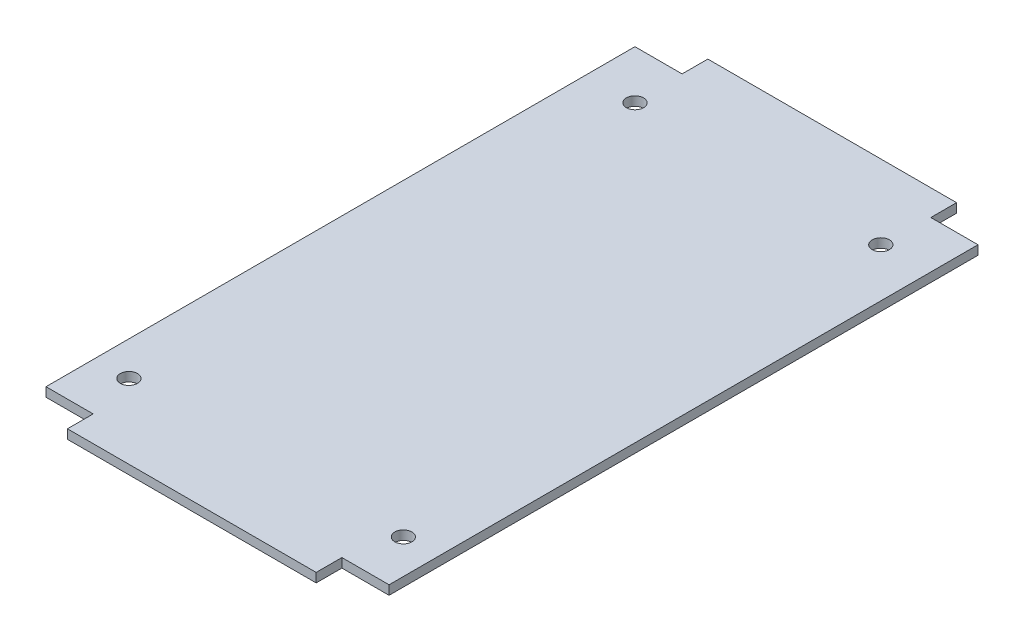
ISO-10303-21;
HEADER;
FILE_DESCRIPTION(('STEP AP214'),'2;1');
FILE_NAME('part.step','',(''),(''),'','','');
FILE_SCHEMA(('AUTOMOTIVE_DESIGN { 1 0 10303 214 1 1 1 1 }'));
ENDSEC;
DATA;
#1=APPLICATION_CONTEXT('core data for automotive mechanical design processes');
#2=APPLICATION_PROTOCOL_DEFINITION('international standard','automotive_design',2000,#1);
#3=PRODUCT_CONTEXT('',#1,'mechanical');
#4=PRODUCT('Part','Part','',(#3));
#5=PRODUCT_RELATED_PRODUCT_CATEGORY('part','',(#4));
#6=PRODUCT_DEFINITION_FORMATION('','',#4);
#7=PRODUCT_DEFINITION_CONTEXT('part definition',#1,'design');
#8=PRODUCT_DEFINITION('design','',#6,#7);
#9=PRODUCT_DEFINITION_SHAPE('','',#8);
#10=(LENGTH_UNIT() NAMED_UNIT(*) SI_UNIT(.MILLI.,.METRE.));
#11=(NAMED_UNIT(*) PLANE_ANGLE_UNIT() SI_UNIT($,.RADIAN.));
#12=(NAMED_UNIT(*) SI_UNIT($,.STERADIAN.) SOLID_ANGLE_UNIT());
#13=UNCERTAINTY_MEASURE_WITH_UNIT(LENGTH_MEASURE(1.E-05),#10,'distance_accuracy_value','');
#14=(GEOMETRIC_REPRESENTATION_CONTEXT(3) GLOBAL_UNCERTAINTY_ASSIGNED_CONTEXT((#13)) GLOBAL_UNIT_ASSIGNED_CONTEXT((#10,
#11,#12)) REPRESENTATION_CONTEXT('',''));
#15=CARTESIAN_POINT('',(0.,0.,0.));
#16=DIRECTION('',(0.,0.,1.));
#17=DIRECTION('',(1.,0.,0.));
#18=AXIS2_PLACEMENT_3D('',#15,#16,#17);
#19=CARTESIAN_POINT('',(21.75,0.,-51.5));
#20=DIRECTION('',(0.,-1.,0.));
#21=DIRECTION('',(0.,0.,-1.));
#22=AXIS2_PLACEMENT_3D('',#19,#20,#21);
#23=PLANE('',#22);
#24=DIRECTION('',(0.,0.,-1.));
#25=VECTOR('',#24,1.);
#26=CARTESIAN_POINT('',(21.75,0.,-51.5));
#27=LINE('',#26,#25);
#28=CARTESIAN_POINT('',(21.75,0.,-56.));
#29=VERTEX_POINT('',#28);
#30=CARTESIAN_POINT('',(21.75,0.,-51.5));
#31=VERTEX_POINT('',#30);
#32=EDGE_CURVE('E367',#29,#31,#27,.F.);
#33=ORIENTED_EDGE('',*,*,#32,.F.);
#34=DIRECTION('',(-1.,0.,0.));
#35=VECTOR('',#34,1.);
#36=CARTESIAN_POINT('',(-21.75,0.,-56.));
#37=LINE('',#36,#35);
#38=CARTESIAN_POINT('',(-21.75,0.,-56.));
#39=VERTEX_POINT('',#38);
#40=EDGE_CURVE('E372',#39,#29,#37,.F.);
#41=ORIENTED_EDGE('',*,*,#40,.F.);
#42=DIRECTION('',(0.,0.,1.));
#43=VECTOR('',#42,1.);
#44=CARTESIAN_POINT('',(-21.75,0.,-51.5));
#45=LINE('',#44,#43);
#46=CARTESIAN_POINT('',(-21.75,0.,-51.5));
#47=VERTEX_POINT('',#46);
#48=EDGE_CURVE('E377',#47,#39,#45,.F.);
#49=ORIENTED_EDGE('',*,*,#48,.F.);
#50=DIRECTION('',(-1.,0.,0.));
#51=VECTOR('',#50,1.);
#52=CARTESIAN_POINT('',(-30.,0.,-51.5));
#53=LINE('',#52,#51);
#54=CARTESIAN_POINT('',(-30.,0.,-51.5));
#55=VERTEX_POINT('',#54);
#56=EDGE_CURVE('E383',#55,#47,#53,.F.);
#57=ORIENTED_EDGE('',*,*,#56,.F.);
#58=DIRECTION('',(0.,0.,1.));
#59=VECTOR('',#58,1.);
#60=CARTESIAN_POINT('',(-30.,0.,-51.5));
#61=LINE('',#60,#59);
#62=CARTESIAN_POINT('',(-30.,0.,51.5));
#63=VERTEX_POINT('',#62);
#64=EDGE_CURVE('E389',#63,#55,#61,.F.);
#65=ORIENTED_EDGE('',*,*,#64,.F.);
#66=DIRECTION('',(1.,0.,0.));
#67=VECTOR('',#66,1.);
#68=CARTESIAN_POINT('',(-30.,0.,51.5));
#69=LINE('',#68,#67);
#70=CARTESIAN_POINT('',(-21.75,0.,51.5));
#71=VERTEX_POINT('',#70);
#72=EDGE_CURVE('E395',#71,#63,#69,.F.);
#73=ORIENTED_EDGE('',*,*,#72,.F.);
#74=DIRECTION('',(0.,0.,1.));
#75=VECTOR('',#74,1.);
#76=CARTESIAN_POINT('',(-21.75,0.,51.5));
#77=LINE('',#76,#75);
#78=CARTESIAN_POINT('',(-21.75,0.,56.));
#79=VERTEX_POINT('',#78);
#80=EDGE_CURVE('E401',#79,#71,#77,.F.);
#81=ORIENTED_EDGE('',*,*,#80,.F.);
#82=DIRECTION('',(1.,0.,0.));
#83=VECTOR('',#82,1.);
#84=CARTESIAN_POINT('',(-21.75,0.,56.));
#85=LINE('',#84,#83);
#86=CARTESIAN_POINT('',(21.75,0.,56.));
#87=VERTEX_POINT('',#86);
#88=EDGE_CURVE('E407',#87,#79,#85,.F.);
#89=ORIENTED_EDGE('',*,*,#88,.F.);
#90=DIRECTION('',(0.,0.,-1.));
#91=VECTOR('',#90,1.);
#92=CARTESIAN_POINT('',(21.75,0.,51.5));
#93=LINE('',#92,#91);
#94=CARTESIAN_POINT('',(21.75,0.,51.5));
#95=VERTEX_POINT('',#94);
#96=EDGE_CURVE('E411',#95,#87,#93,.F.);
#97=ORIENTED_EDGE('',*,*,#96,.F.);
#98=DIRECTION('',(1.,0.,0.));
#99=VECTOR('',#98,1.);
#100=CARTESIAN_POINT('',(30.,0.,51.5));
#101=LINE('',#100,#99);
#102=CARTESIAN_POINT('',(30.,0.,51.5));
#103=VERTEX_POINT('',#102);
#104=EDGE_CURVE('E104',#103,#95,#101,.F.);
#105=ORIENTED_EDGE('',*,*,#104,.F.);
#106=DIRECTION('',(0.,0.,-1.));
#107=VECTOR('',#106,1.);
#108=CARTESIAN_POINT('',(30.,0.,-51.5));
#109=LINE('',#108,#107);
#110=CARTESIAN_POINT('',(30.,0.,-51.5));
#111=VERTEX_POINT('',#110);
#112=EDGE_CURVE('E106',#111,#103,#109,.F.);
#113=ORIENTED_EDGE('',*,*,#112,.F.);
#114=DIRECTION('',(-1.,0.,0.));
#115=VECTOR('',#114,1.);
#116=CARTESIAN_POINT('',(30.,0.,-51.5));
#117=LINE('',#116,#115);
#118=EDGE_CURVE('E109',#31,#111,#117,.F.);
#119=ORIENTED_EDGE('',*,*,#118,.F.);
#120=EDGE_LOOP('',(#33,#41,#49,#57,#65,#73,#81,#89,#97,#105,#113,#119));
#121=FACE_BOUND('',#120,.T.);
#122=CARTESIAN_POINT('',(-21.5,0.,-43.));
#123=DIRECTION('',(0.,1.,0.));
#124=DIRECTION('',(0.,0.,1.));
#125=AXIS2_PLACEMENT_3D('',#122,#123,#124);
#126=CIRCLE('',#125,1.5);
#127=CARTESIAN_POINT('',(-21.5,0.,-41.5));
#128=VERTEX_POINT('',#127);
#129=EDGE_CURVE('E122',#128,#128,#126,.F.);
#130=ORIENTED_EDGE('',*,*,#129,.T.);
#131=EDGE_LOOP('',(#130));
#132=FACE_BOUND('',#131,.T.);
#133=CARTESIAN_POINT('',(-24.,0.,43.));
#134=DIRECTION('',(0.,1.,0.));
#135=DIRECTION('',(0.,0.,1.));
#136=AXIS2_PLACEMENT_3D('',#133,#134,#135);
#137=CIRCLE('',#136,1.5);
#138=CARTESIAN_POINT('',(-24.,0.,44.5));
#139=VERTEX_POINT('',#138);
#140=EDGE_CURVE('E148',#139,#139,#137,.F.);
#141=ORIENTED_EDGE('',*,*,#140,.T.);
#142=EDGE_LOOP('',(#141));
#143=FACE_BOUND('',#142,.T.);
#144=CARTESIAN_POINT('',(24.,0.,43.));
#145=DIRECTION('',(0.,1.,0.));
#146=DIRECTION('',(0.,0.,1.));
#147=AXIS2_PLACEMENT_3D('',#144,#145,#146);
#148=CIRCLE('',#147,1.5);
#149=CARTESIAN_POINT('',(24.,0.,44.5));
#150=VERTEX_POINT('',#149);
#151=EDGE_CURVE('E150',#150,#150,#148,.F.);
#152=ORIENTED_EDGE('',*,*,#151,.T.);
#153=EDGE_LOOP('',(#152));
#154=FACE_BOUND('',#153,.T.);
#155=CARTESIAN_POINT('',(21.5,0.,-43.));
#156=DIRECTION('',(0.,1.,0.));
#157=DIRECTION('',(0.,0.,1.));
#158=AXIS2_PLACEMENT_3D('',#155,#156,#157);
#159=CIRCLE('',#158,1.5);
#160=CARTESIAN_POINT('',(21.5,0.,-41.5));
#161=VERTEX_POINT('',#160);
#162=EDGE_CURVE('E20',#161,#161,#159,.F.);
#163=ORIENTED_EDGE('',*,*,#162,.T.);
#164=EDGE_LOOP('',(#163));
#165=FACE_BOUND('',#164,.T.);
#166=ADVANCED_FACE('F17',(#121,#132,#143,#154,#165),#23,.F.);
#167=CARTESIAN_POINT('',(21.5,-1.6,-43.));
#168=DIRECTION('',(0.,1.,0.));
#169=DIRECTION('',(0.,0.,1.));
#170=AXIS2_PLACEMENT_3D('',#167,#168,#169);
#171=CYLINDRICAL_SURFACE('',#170,1.5);
#172=ORIENTED_EDGE('',*,*,#162,.F.);
#173=EDGE_LOOP('',(#172));
#174=FACE_BOUND('',#173,.T.);
#175=CARTESIAN_POINT('',(21.5,-1.6,-43.));
#176=DIRECTION('',(0.,1.,0.));
#177=DIRECTION('',(0.,0.,1.));
#178=AXIS2_PLACEMENT_3D('',#175,#176,#177);
#179=CIRCLE('',#178,1.5);
#180=CARTESIAN_POINT('',(21.5,-1.6,-41.5));
#181=VERTEX_POINT('',#180);
#182=EDGE_CURVE('E143',#181,#181,#179,.T.);
#183=ORIENTED_EDGE('',*,*,#182,.F.);
#184=EDGE_LOOP('',(#183));
#185=FACE_BOUND('',#184,.T.);
#186=ADVANCED_FACE('F158',(#174,#185),#171,.F.);
#187=CARTESIAN_POINT('',(24.,-1.6,43.));
#188=DIRECTION('',(0.,1.,0.));
#189=DIRECTION('',(0.,0.,1.));
#190=AXIS2_PLACEMENT_3D('',#187,#188,#189);
#191=CYLINDRICAL_SURFACE('',#190,1.5);
#192=ORIENTED_EDGE('',*,*,#151,.F.);
#193=EDGE_LOOP('',(#192));
#194=FACE_BOUND('',#193,.T.);
#195=CARTESIAN_POINT('',(24.,-1.6,43.));
#196=DIRECTION('',(0.,1.,0.));
#197=DIRECTION('',(0.,0.,1.));
#198=AXIS2_PLACEMENT_3D('',#195,#196,#197);
#199=CIRCLE('',#198,1.5);
#200=CARTESIAN_POINT('',(24.,-1.6,44.5));
#201=VERTEX_POINT('',#200);
#202=EDGE_CURVE('E140',#201,#201,#199,.T.);
#203=ORIENTED_EDGE('',*,*,#202,.F.);
#204=EDGE_LOOP('',(#203));
#205=FACE_BOUND('',#204,.T.);
#206=ADVANCED_FACE('F161',(#194,#205),#191,.F.);
#207=CARTESIAN_POINT('',(-24.,-1.6,43.));
#208=DIRECTION('',(0.,1.,0.));
#209=DIRECTION('',(0.,0.,1.));
#210=AXIS2_PLACEMENT_3D('',#207,#208,#209);
#211=CYLINDRICAL_SURFACE('',#210,1.5);
#212=ORIENTED_EDGE('',*,*,#140,.F.);
#213=EDGE_LOOP('',(#212));
#214=FACE_BOUND('',#213,.T.);
#215=CARTESIAN_POINT('',(-24.,-1.6,43.));
#216=DIRECTION('',(0.,1.,0.));
#217=DIRECTION('',(0.,0.,1.));
#218=AXIS2_PLACEMENT_3D('',#215,#216,#217);
#219=CIRCLE('',#218,1.5);
#220=CARTESIAN_POINT('',(-24.,-1.6,44.5));
#221=VERTEX_POINT('',#220);
#222=EDGE_CURVE('E137',#221,#221,#219,.T.);
#223=ORIENTED_EDGE('',*,*,#222,.F.);
#224=EDGE_LOOP('',(#223));
#225=FACE_BOUND('',#224,.T.);
#226=ADVANCED_FACE('F220',(#214,#225),#211,.F.);
#227=CARTESIAN_POINT('',(-21.5,-1.6,-43.));
#228=DIRECTION('',(0.,1.,0.));
#229=DIRECTION('',(0.,0.,1.));
#230=AXIS2_PLACEMENT_3D('',#227,#228,#229);
#231=CYLINDRICAL_SURFACE('',#230,1.5);
#232=ORIENTED_EDGE('',*,*,#129,.F.);
#233=EDGE_LOOP('',(#232));
#234=FACE_BOUND('',#233,.T.);
#235=CARTESIAN_POINT('',(-21.5,-1.6,-43.));
#236=DIRECTION('',(0.,1.,0.));
#237=DIRECTION('',(0.,0.,1.));
#238=AXIS2_PLACEMENT_3D('',#235,#236,#237);
#239=CIRCLE('',#238,1.5);
#240=CARTESIAN_POINT('',(-21.5,-1.6,-41.5));
#241=VERTEX_POINT('',#240);
#242=EDGE_CURVE('E133',#241,#241,#239,.T.);
#243=ORIENTED_EDGE('',*,*,#242,.F.);
#244=EDGE_LOOP('',(#243));
#245=FACE_BOUND('',#244,.T.);
#246=ADVANCED_FACE('F217',(#234,#245),#231,.F.);
#247=CARTESIAN_POINT('',(30.,-1.6,-51.5));
#248=DIRECTION('',(0.,0.,-1.));
#249=DIRECTION('',(-1.,0.,0.));
#250=AXIS2_PLACEMENT_3D('',#247,#248,#249);
#251=PLANE('',#250);
#252=DIRECTION('',(1.,0.,0.));
#253=VECTOR('',#252,1.);
#254=CARTESIAN_POINT('',(21.75,-1.6,-51.5));
#255=LINE('',#254,#253);
#256=CARTESIAN_POINT('',(21.75,-1.6,-51.5));
#257=VERTEX_POINT('',#256);
#258=CARTESIAN_POINT('',(30.,-1.6,-51.5));
#259=VERTEX_POINT('',#258);
#260=EDGE_CURVE('E136',#257,#259,#255,.T.);
#261=ORIENTED_EDGE('',*,*,#260,.F.);
#262=DIRECTION('',(0.,1.,0.));
#263=VECTOR('',#262,1.);
#264=CARTESIAN_POINT('',(21.75,-1.6,-51.5));
#265=LINE('',#264,#263);
#266=EDGE_CURVE('E120',#31,#257,#265,.F.);
#267=ORIENTED_EDGE('',*,*,#266,.F.);
#268=ORIENTED_EDGE('',*,*,#118,.T.);
#269=DIRECTION('',(0.,1.,0.));
#270=VECTOR('',#269,1.);
#271=CARTESIAN_POINT('',(30.,-1.6,-51.5));
#272=LINE('',#271,#270);
#273=EDGE_CURVE('E114',#259,#111,#272,.T.);
#274=ORIENTED_EDGE('',*,*,#273,.F.);
#275=EDGE_LOOP('',(#261,#267,#268,#274));
#276=FACE_BOUND('',#275,.T.);
#277=ADVANCED_FACE('F117',(#276),#251,.T.);
#278=CARTESIAN_POINT('',(30.,-1.6,-51.5));
#279=DIRECTION('',(1.,0.,0.));
#280=DIRECTION('',(0.,0.,-1.));
#281=AXIS2_PLACEMENT_3D('',#278,#279,#280);
#282=PLANE('',#281);
#283=DIRECTION('',(0.,0.,-1.));
#284=VECTOR('',#283,1.);
#285=CARTESIAN_POINT('',(30.,-1.6,-51.5));
#286=LINE('',#285,#284);
#287=CARTESIAN_POINT('',(30.,-1.6,51.5));
#288=VERTEX_POINT('',#287);
#289=EDGE_CURVE('E126',#259,#288,#286,.F.);
#290=ORIENTED_EDGE('',*,*,#289,.F.);
#291=ORIENTED_EDGE('',*,*,#273,.T.);
#292=ORIENTED_EDGE('',*,*,#112,.T.);
#293=DIRECTION('',(0.,1.,0.));
#294=VECTOR('',#293,1.);
#295=CARTESIAN_POINT('',(30.,-1.6,51.5));
#296=LINE('',#295,#294);
#297=EDGE_CURVE('E129',#288,#103,#296,.T.);
#298=ORIENTED_EDGE('',*,*,#297,.F.);
#299=EDGE_LOOP('',(#290,#291,#292,#298));
#300=FACE_BOUND('',#299,.T.);
#301=ADVANCED_FACE('F124',(#300),#282,.T.);
#302=CARTESIAN_POINT('',(30.,-1.6,51.5));
#303=DIRECTION('',(0.,0.,1.));
#304=DIRECTION('',(1.,0.,0.));
#305=AXIS2_PLACEMENT_3D('',#302,#303,#304);
#306=PLANE('',#305);
#307=DIRECTION('',(1.,0.,0.));
#308=VECTOR('',#307,1.);
#309=CARTESIAN_POINT('',(21.75,-1.6,51.5));
#310=LINE('',#309,#308);
#311=CARTESIAN_POINT('',(21.75,-1.6,51.5));
#312=VERTEX_POINT('',#311);
#313=EDGE_CURVE('E354',#288,#312,#310,.F.);
#314=ORIENTED_EDGE('',*,*,#313,.F.);
#315=ORIENTED_EDGE('',*,*,#297,.T.);
#316=ORIENTED_EDGE('',*,*,#104,.T.);
#317=DIRECTION('',(0.,1.,0.));
#318=VECTOR('',#317,1.);
#319=CARTESIAN_POINT('',(21.75,-1.6,51.5));
#320=LINE('',#319,#318);
#321=EDGE_CURVE('E356',#312,#95,#320,.T.);
#322=ORIENTED_EDGE('',*,*,#321,.F.);
#323=EDGE_LOOP('',(#314,#315,#316,#322));
#324=FACE_BOUND('',#323,.T.);
#325=ADVANCED_FACE('F208',(#324),#306,.T.);
#326=CARTESIAN_POINT('',(21.75,-1.6,51.5));
#327=DIRECTION('',(1.,0.,0.));
#328=DIRECTION('',(0.,0.,-1.));
#329=AXIS2_PLACEMENT_3D('',#326,#327,#328);
#330=PLANE('',#329);
#331=DIRECTION('',(0.,0.,-1.));
#332=VECTOR('',#331,1.);
#333=CARTESIAN_POINT('',(21.75,-1.6,-51.5));
#334=LINE('',#333,#332);
#335=CARTESIAN_POINT('',(21.75,-1.6,56.));
#336=VERTEX_POINT('',#335);
#337=EDGE_CURVE('E359',#312,#336,#334,.F.);
#338=ORIENTED_EDGE('',*,*,#337,.F.);
#339=ORIENTED_EDGE('',*,*,#321,.T.);
#340=ORIENTED_EDGE('',*,*,#96,.T.);
#341=DIRECTION('',(0.,1.,0.));
#342=VECTOR('',#341,1.);
#343=CARTESIAN_POINT('',(21.75,-1.6,56.));
#344=LINE('',#343,#342);
#345=EDGE_CURVE('E404',#336,#87,#344,.T.);
#346=ORIENTED_EDGE('',*,*,#345,.F.);
#347=EDGE_LOOP('',(#338,#339,#340,#346));
#348=FACE_BOUND('',#347,.T.);
#349=ADVANCED_FACE('F204',(#348),#330,.T.);
#350=CARTESIAN_POINT('',(-21.75,-1.6,56.));
#351=DIRECTION('',(0.,0.,1.));
#352=DIRECTION('',(1.,0.,0.));
#353=AXIS2_PLACEMENT_3D('',#350,#351,#352);
#354=PLANE('',#353);
#355=DIRECTION('',(1.,0.,0.));
#356=VECTOR('',#355,1.);
#357=CARTESIAN_POINT('',(21.75,-1.6,56.));
#358=LINE('',#357,#356);
#359=CARTESIAN_POINT('',(-21.75,-1.6,56.));
#360=VERTEX_POINT('',#359);
#361=EDGE_CURVE('E415',#336,#360,#358,.F.);
#362=ORIENTED_EDGE('',*,*,#361,.F.);
#363=ORIENTED_EDGE('',*,*,#345,.T.);
#364=ORIENTED_EDGE('',*,*,#88,.T.);
#365=DIRECTION('',(0.,1.,0.));
#366=VECTOR('',#365,1.);
#367=CARTESIAN_POINT('',(-21.75,-1.6,56.));
#368=LINE('',#367,#366);
#369=EDGE_CURVE('E398',#360,#79,#368,.T.);
#370=ORIENTED_EDGE('',*,*,#369,.F.);
#371=EDGE_LOOP('',(#362,#363,#364,#370));
#372=FACE_BOUND('',#371,.T.);
#373=ADVANCED_FACE('F200',(#372),#354,.T.);
#374=CARTESIAN_POINT('',(-21.75,-1.6,51.5));
#375=DIRECTION('',(-1.,0.,0.));
#376=DIRECTION('',(0.,0.,1.));
#377=AXIS2_PLACEMENT_3D('',#374,#375,#376);
#378=PLANE('',#377);
#379=DIRECTION('',(0.,0.,-1.));
#380=VECTOR('',#379,1.);
#381=CARTESIAN_POINT('',(-21.75,-1.6,-51.5));
#382=LINE('',#381,#380);
#383=CARTESIAN_POINT('',(-21.75,-1.6,51.5));
#384=VERTEX_POINT('',#383);
#385=EDGE_CURVE('E418',#360,#384,#382,.T.);
#386=ORIENTED_EDGE('',*,*,#385,.F.);
#387=ORIENTED_EDGE('',*,*,#369,.T.);
#388=ORIENTED_EDGE('',*,*,#80,.T.);
#389=DIRECTION('',(0.,1.,0.));
#390=VECTOR('',#389,1.);
#391=CARTESIAN_POINT('',(-21.75,-1.6,51.5));
#392=LINE('',#391,#390);
#393=EDGE_CURVE('E392',#384,#71,#392,.T.);
#394=ORIENTED_EDGE('',*,*,#393,.F.);
#395=EDGE_LOOP('',(#386,#387,#388,#394));
#396=FACE_BOUND('',#395,.T.);
#397=ADVANCED_FACE('F196',(#396),#378,.T.);
#398=CARTESIAN_POINT('',(-30.,-1.6,51.5));
#399=DIRECTION('',(0.,0.,1.));
#400=DIRECTION('',(1.,0.,0.));
#401=AXIS2_PLACEMENT_3D('',#398,#399,#400);
#402=PLANE('',#401);
#403=DIRECTION('',(1.,0.,0.));
#404=VECTOR('',#403,1.);
#405=CARTESIAN_POINT('',(21.75,-1.6,51.5));
#406=LINE('',#405,#404);
#407=CARTESIAN_POINT('',(-30.,-1.6,51.5));
#408=VERTEX_POINT('',#407);
#409=EDGE_CURVE('E422',#384,#408,#406,.F.);
#410=ORIENTED_EDGE('',*,*,#409,.F.);
#411=ORIENTED_EDGE('',*,*,#393,.T.);
#412=ORIENTED_EDGE('',*,*,#72,.T.);
#413=DIRECTION('',(0.,1.,0.));
#414=VECTOR('',#413,1.);
#415=CARTESIAN_POINT('',(-30.,-1.6,51.5));
#416=LINE('',#415,#414);
#417=EDGE_CURVE('E386',#408,#63,#416,.T.);
#418=ORIENTED_EDGE('',*,*,#417,.F.);
#419=EDGE_LOOP('',(#410,#411,#412,#418));
#420=FACE_BOUND('',#419,.T.);
#421=ADVANCED_FACE('F192',(#420),#402,.T.);
#422=CARTESIAN_POINT('',(-30.,-1.6,-51.5));
#423=DIRECTION('',(-1.,0.,0.));
#424=DIRECTION('',(0.,0.,1.));
#425=AXIS2_PLACEMENT_3D('',#422,#423,#424);
#426=PLANE('',#425);
#427=DIRECTION('',(0.,0.,-1.));
#428=VECTOR('',#427,1.);
#429=CARTESIAN_POINT('',(-30.,-1.6,-51.5));
#430=LINE('',#429,#428);
#431=CARTESIAN_POINT('',(-30.,-1.6,-51.5));
#432=VERTEX_POINT('',#431);
#433=EDGE_CURVE('E425',#408,#432,#430,.T.);
#434=ORIENTED_EDGE('',*,*,#433,.F.);
#435=ORIENTED_EDGE('',*,*,#417,.T.);
#436=ORIENTED_EDGE('',*,*,#64,.T.);
#437=DIRECTION('',(0.,1.,0.));
#438=VECTOR('',#437,1.);
#439=CARTESIAN_POINT('',(-30.,-1.6,-51.5));
#440=LINE('',#439,#438);
#441=EDGE_CURVE('E380',#432,#55,#440,.T.);
#442=ORIENTED_EDGE('',*,*,#441,.F.);
#443=EDGE_LOOP('',(#434,#435,#436,#442));
#444=FACE_BOUND('',#443,.T.);
#445=ADVANCED_FACE('F188',(#444),#426,.T.);
#446=CARTESIAN_POINT('',(-30.,-1.6,-51.5));
#447=DIRECTION('',(0.,0.,-1.));
#448=DIRECTION('',(-1.,0.,0.));
#449=AXIS2_PLACEMENT_3D('',#446,#447,#448);
#450=PLANE('',#449);
#451=DIRECTION('',(1.,0.,0.));
#452=VECTOR('',#451,1.);
#453=CARTESIAN_POINT('',(21.75,-1.6,-51.5));
#454=LINE('',#453,#452);
#455=CARTESIAN_POINT('',(-21.75,-1.6,-51.5));
#456=VERTEX_POINT('',#455);
#457=EDGE_CURVE('E428',#432,#456,#454,.T.);
#458=ORIENTED_EDGE('',*,*,#457,.F.);
#459=ORIENTED_EDGE('',*,*,#441,.T.);
#460=ORIENTED_EDGE('',*,*,#56,.T.);
#461=DIRECTION('',(0.,1.,0.));
#462=VECTOR('',#461,1.);
#463=CARTESIAN_POINT('',(-21.75,-1.6,-51.5));
#464=LINE('',#463,#462);
#465=EDGE_CURVE('E374',#456,#47,#464,.T.);
#466=ORIENTED_EDGE('',*,*,#465,.F.);
#467=EDGE_LOOP('',(#458,#459,#460,#466));
#468=FACE_BOUND('',#467,.T.);
#469=ADVANCED_FACE('F184',(#468),#450,.T.);
#470=CARTESIAN_POINT('',(-21.75,-1.6,-51.5));
#471=DIRECTION('',(-1.,0.,0.));
#472=DIRECTION('',(0.,0.,1.));
#473=AXIS2_PLACEMENT_3D('',#470,#471,#472);
#474=PLANE('',#473);
#475=DIRECTION('',(0.,0.,-1.));
#476=VECTOR('',#475,1.);
#477=CARTESIAN_POINT('',(-21.75,-1.6,-51.5));
#478=LINE('',#477,#476);
#479=CARTESIAN_POINT('',(-21.75,-1.6,-56.));
#480=VERTEX_POINT('',#479);
#481=EDGE_CURVE('E431',#456,#480,#478,.T.);
#482=ORIENTED_EDGE('',*,*,#481,.F.);
#483=ORIENTED_EDGE('',*,*,#465,.T.);
#484=ORIENTED_EDGE('',*,*,#48,.T.);
#485=DIRECTION('',(0.,1.,0.));
#486=VECTOR('',#485,1.);
#487=CARTESIAN_POINT('',(-21.75,-1.6,-56.));
#488=LINE('',#487,#486);
#489=EDGE_CURVE('E369',#480,#39,#488,.T.);
#490=ORIENTED_EDGE('',*,*,#489,.F.);
#491=EDGE_LOOP('',(#482,#483,#484,#490));
#492=FACE_BOUND('',#491,.T.);
#493=ADVANCED_FACE('F181',(#492),#474,.T.);
#494=CARTESIAN_POINT('',(-21.75,-1.6,-56.));
#495=DIRECTION('',(0.,0.,-1.));
#496=DIRECTION('',(-1.,0.,0.));
#497=AXIS2_PLACEMENT_3D('',#494,#495,#496);
#498=PLANE('',#497);
#499=DIRECTION('',(1.,0.,0.));
#500=VECTOR('',#499,1.);
#501=CARTESIAN_POINT('',(21.75,-1.6,-56.));
#502=LINE('',#501,#500);
#503=CARTESIAN_POINT('',(21.75,-1.6,-56.));
#504=VERTEX_POINT('',#503);
#505=EDGE_CURVE('E26',#480,#504,#502,.T.);
#506=ORIENTED_EDGE('',*,*,#505,.F.);
#507=ORIENTED_EDGE('',*,*,#489,.T.);
#508=ORIENTED_EDGE('',*,*,#40,.T.);
#509=DIRECTION('',(0.,1.,0.));
#510=VECTOR('',#509,1.);
#511=CARTESIAN_POINT('',(21.75,-1.6,-56.));
#512=LINE('',#511,#510);
#513=EDGE_CURVE('E35',#504,#29,#512,.T.);
#514=ORIENTED_EDGE('',*,*,#513,.F.);
#515=EDGE_LOOP('',(#506,#507,#508,#514));
#516=FACE_BOUND('',#515,.T.);
#517=ADVANCED_FACE('F173',(#516),#498,.T.);
#518=CARTESIAN_POINT('',(21.75,-1.6,-51.5));
#519=DIRECTION('',(1.,0.,0.));
#520=DIRECTION('',(0.,0.,-1.));
#521=AXIS2_PLACEMENT_3D('',#518,#519,#520);
#522=PLANE('',#521);
#523=DIRECTION('',(0.,0.,-1.));
#524=VECTOR('',#523,1.);
#525=CARTESIAN_POINT('',(21.75,-1.6,-51.5));
#526=LINE('',#525,#524);
#527=EDGE_CURVE('E11',#504,#257,#526,.F.);
#528=ORIENTED_EDGE('',*,*,#527,.F.);
#529=ORIENTED_EDGE('',*,*,#513,.T.);
#530=ORIENTED_EDGE('',*,*,#32,.T.);
#531=ORIENTED_EDGE('',*,*,#266,.T.);
#532=EDGE_LOOP('',(#528,#529,#530,#531));
#533=FACE_BOUND('',#532,.T.);
#534=ADVANCED_FACE('F166',(#533),#522,.T.);
#535=CARTESIAN_POINT('',(21.75,-1.6,-51.5));
#536=DIRECTION('',(0.,-1.,0.));
#537=DIRECTION('',(0.,0.,-1.));
#538=AXIS2_PLACEMENT_3D('',#535,#536,#537);
#539=PLANE('',#538);
#540=ORIENTED_EDGE('',*,*,#505,.T.);
#541=ORIENTED_EDGE('',*,*,#527,.T.);
#542=ORIENTED_EDGE('',*,*,#260,.T.);
#543=ORIENTED_EDGE('',*,*,#289,.T.);
#544=ORIENTED_EDGE('',*,*,#313,.T.);
#545=ORIENTED_EDGE('',*,*,#337,.T.);
#546=ORIENTED_EDGE('',*,*,#361,.T.);
#547=ORIENTED_EDGE('',*,*,#385,.T.);
#548=ORIENTED_EDGE('',*,*,#409,.T.);
#549=ORIENTED_EDGE('',*,*,#433,.T.);
#550=ORIENTED_EDGE('',*,*,#457,.T.);
#551=ORIENTED_EDGE('',*,*,#481,.T.);
#552=EDGE_LOOP('',(#540,#541,#542,#543,#544,#545,#546,#547,#548,#549,#550,#551));
#553=FACE_BOUND('',#552,.T.);
#554=ORIENTED_EDGE('',*,*,#242,.T.);
#555=EDGE_LOOP('',(#554));
#556=FACE_BOUND('',#555,.T.);
#557=ORIENTED_EDGE('',*,*,#222,.T.);
#558=EDGE_LOOP('',(#557));
#559=FACE_BOUND('',#558,.T.);
#560=ORIENTED_EDGE('',*,*,#202,.T.);
#561=EDGE_LOOP('',(#560));
#562=FACE_BOUND('',#561,.T.);
#563=ORIENTED_EDGE('',*,*,#182,.T.);
#564=EDGE_LOOP('',(#563));
#565=FACE_BOUND('',#564,.T.);
#566=ADVANCED_FACE('F164',(#553,#556,#559,#562,#565),#539,.T.);
#567=CLOSED_SHELL('',(#166,#186,#206,#226,#246,#277,#301,#325,#349,#373,#397,#421,#445,#469,
#493,#517,#534,#566));
#568=MANIFOLD_SOLID_BREP('B1',#567);
#569=ADVANCED_BREP_SHAPE_REPRESENTATION('',(#18,#568),#14);
#570=SHAPE_DEFINITION_REPRESENTATION(#9,#569);
ENDSEC;
END-ISO-10303-21;
